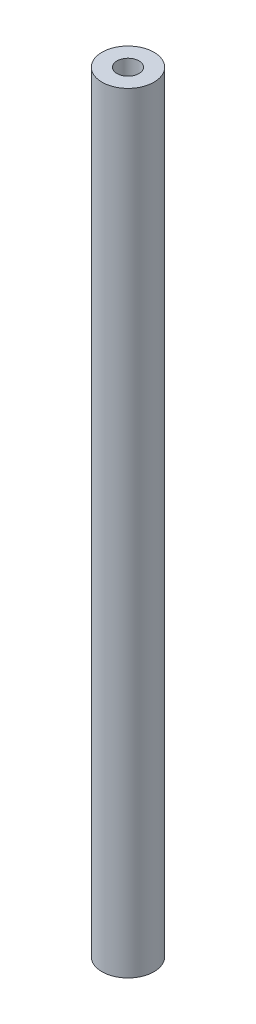
ISO-10303-21;
HEADER;
FILE_DESCRIPTION(('STEP AP214'),'2;1');
FILE_NAME('part.step','',(''),(''),'','','');
FILE_SCHEMA(('AUTOMOTIVE_DESIGN { 1 0 10303 214 1 1 1 1 }'));
ENDSEC;
DATA;
#1=APPLICATION_CONTEXT('core data for automotive mechanical design processes');
#2=APPLICATION_PROTOCOL_DEFINITION('international standard','automotive_design',2000,#1);
#3=PRODUCT_CONTEXT('',#1,'mechanical');
#4=PRODUCT('Part','Part','',(#3));
#5=PRODUCT_RELATED_PRODUCT_CATEGORY('part','',(#4));
#6=PRODUCT_DEFINITION_FORMATION('','',#4);
#7=PRODUCT_DEFINITION_CONTEXT('part definition',#1,'design');
#8=PRODUCT_DEFINITION('design','',#6,#7);
#9=PRODUCT_DEFINITION_SHAPE('','',#8);
#10=(LENGTH_UNIT() NAMED_UNIT(*) SI_UNIT(.MILLI.,.METRE.));
#11=(NAMED_UNIT(*) PLANE_ANGLE_UNIT() SI_UNIT($,.RADIAN.));
#12=(NAMED_UNIT(*) SI_UNIT($,.STERADIAN.) SOLID_ANGLE_UNIT());
#13=UNCERTAINTY_MEASURE_WITH_UNIT(LENGTH_MEASURE(1.E-05),#10,'distance_accuracy_value','');
#14=(GEOMETRIC_REPRESENTATION_CONTEXT(3) GLOBAL_UNCERTAINTY_ASSIGNED_CONTEXT((#13)) GLOBAL_UNIT_ASSIGNED_CONTEXT((#10,
#11,#12)) REPRESENTATION_CONTEXT('',''));
#15=CARTESIAN_POINT('',(0.,0.,0.));
#16=DIRECTION('',(0.,0.,1.));
#17=DIRECTION('',(1.,0.,0.));
#18=AXIS2_PLACEMENT_3D('',#15,#16,#17);
#19=CARTESIAN_POINT('',(0.,141.2875,0.));
#20=DIRECTION('',(0.,1.,0.));
#21=DIRECTION('',(0.,0.,1.));
#22=AXIS2_PLACEMENT_3D('',#19,#20,#21);
#23=PLANE('',#22);
#24=CARTESIAN_POINT('',(0.,141.2875,0.));
#25=DIRECTION('',(0.,1.,0.));
#26=DIRECTION('',(0.,0.,1.));
#27=AXIS2_PLACEMENT_3D('',#24,#25,#26);
#28=CIRCLE('',#27,4.7625);
#29=CARTESIAN_POINT('',(0.,141.2875,4.7625));
#30=VERTEX_POINT('',#29);
#31=EDGE_CURVE('E10',#30,#30,#28,.T.);
#32=ORIENTED_EDGE('',*,*,#31,.T.);
#33=EDGE_LOOP('',(#32));
#34=FACE_BOUND('',#33,.T.);
#35=CARTESIAN_POINT('',(0.,141.2875,0.));
#36=DIRECTION('',(0.,1.,0.));
#37=DIRECTION('',(0.,0.,1.));
#38=AXIS2_PLACEMENT_3D('',#35,#36,#37);
#39=CIRCLE('',#38,2.0193);
#40=CARTESIAN_POINT('',(0.,141.2875,2.0193));
#41=VERTEX_POINT('',#40);
#42=EDGE_CURVE('E42',#41,#41,#39,.T.);
#43=ORIENTED_EDGE('',*,*,#42,.F.);
#44=EDGE_LOOP('',(#43));
#45=FACE_BOUND('',#44,.T.);
#46=ADVANCED_FACE('F31',(#34,#45),#23,.T.);
#47=CARTESIAN_POINT('',(0.,0.,0.));
#48=DIRECTION('',(0.,1.,0.));
#49=DIRECTION('',(0.,0.,1.));
#50=AXIS2_PLACEMENT_3D('',#47,#48,#49);
#51=PLANE('',#50);
#52=CARTESIAN_POINT('',(0.,0.,0.));
#53=DIRECTION('',(0.,1.,0.));
#54=DIRECTION('',(0.,0.,1.));
#55=AXIS2_PLACEMENT_3D('',#52,#53,#54);
#56=CIRCLE('',#55,4.7625);
#57=CARTESIAN_POINT('',(0.,0.,4.7625));
#58=VERTEX_POINT('',#57);
#59=EDGE_CURVE('E35',#58,#58,#56,.T.);
#60=ORIENTED_EDGE('',*,*,#59,.F.);
#61=EDGE_LOOP('',(#60));
#62=FACE_BOUND('',#61,.T.);
#63=CARTESIAN_POINT('',(0.,0.,0.));
#64=DIRECTION('',(0.,1.,0.));
#65=DIRECTION('',(0.,0.,1.));
#66=AXIS2_PLACEMENT_3D('',#63,#64,#65);
#67=CIRCLE('',#66,2.0193);
#68=CARTESIAN_POINT('',(0.,0.,2.0193));
#69=VERTEX_POINT('',#68);
#70=EDGE_CURVE('E44',#69,#69,#67,.T.);
#71=ORIENTED_EDGE('',*,*,#70,.T.);
#72=EDGE_LOOP('',(#71));
#73=FACE_BOUND('',#72,.T.);
#74=ADVANCED_FACE('F54',(#62,#73),#51,.F.);
#75=CARTESIAN_POINT('',(0.,141.2875,0.));
#76=DIRECTION('',(0.,-1.,0.));
#77=DIRECTION('',(0.,0.,-1.));
#78=AXIS2_PLACEMENT_3D('',#75,#76,#77);
#79=CYLINDRICAL_SURFACE('',#78,4.7625);
#80=ORIENTED_EDGE('',*,*,#31,.F.);
#81=EDGE_LOOP('',(#80));
#82=FACE_BOUND('',#81,.T.);
#83=ORIENTED_EDGE('',*,*,#59,.T.);
#84=EDGE_LOOP('',(#83));
#85=FACE_BOUND('',#84,.T.);
#86=ADVANCED_FACE('F33',(#82,#85),#79,.T.);
#87=CARTESIAN_POINT('',(0.,141.2875,0.));
#88=DIRECTION('',(0.,-1.,0.));
#89=DIRECTION('',(0.,0.,-1.));
#90=AXIS2_PLACEMENT_3D('',#87,#88,#89);
#91=CYLINDRICAL_SURFACE('',#90,2.0193);
#92=ORIENTED_EDGE('',*,*,#42,.T.);
#93=EDGE_LOOP('',(#92));
#94=FACE_BOUND('',#93,.T.);
#95=ORIENTED_EDGE('',*,*,#70,.F.);
#96=EDGE_LOOP('',(#95));
#97=FACE_BOUND('',#96,.T.);
#98=ADVANCED_FACE('F50',(#94,#97),#91,.F.);
#99=CLOSED_SHELL('',(#46,#74,#86,#98));
#100=MANIFOLD_SOLID_BREP('B2',#99);
#101=ADVANCED_BREP_SHAPE_REPRESENTATION('',(#18,#100),#14);
#102=SHAPE_DEFINITION_REPRESENTATION(#9,#101);
ENDSEC;
END-ISO-10303-21;
